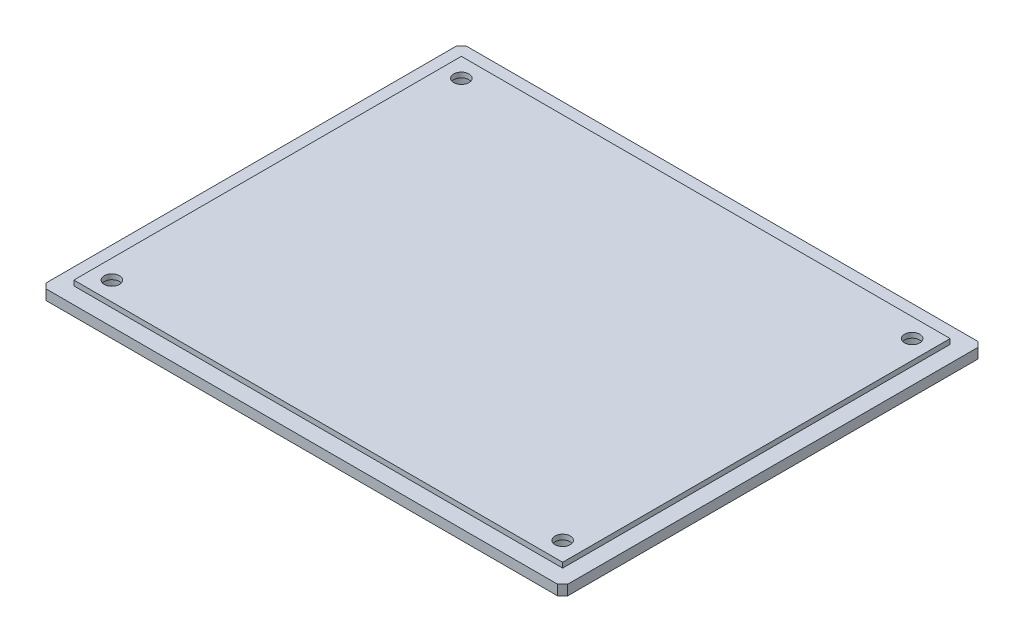
ISO-10303-21;
HEADER;
FILE_DESCRIPTION(('STEP AP214'),'2;1');
FILE_NAME('part.step','',(''),(''),'','','');
FILE_SCHEMA(('AUTOMOTIVE_DESIGN { 1 0 10303 214 1 1 1 1 }'));
ENDSEC;
DATA;
#1=APPLICATION_CONTEXT('core data for automotive mechanical design processes');
#2=APPLICATION_PROTOCOL_DEFINITION('international standard','automotive_design',2000,#1);
#3=PRODUCT_CONTEXT('',#1,'mechanical');
#4=PRODUCT('Part','Part','',(#3));
#5=PRODUCT_RELATED_PRODUCT_CATEGORY('part','',(#4));
#6=PRODUCT_DEFINITION_FORMATION('','',#4);
#7=PRODUCT_DEFINITION_CONTEXT('part definition',#1,'design');
#8=PRODUCT_DEFINITION('design','',#6,#7);
#9=PRODUCT_DEFINITION_SHAPE('','',#8);
#10=(LENGTH_UNIT() NAMED_UNIT(*) SI_UNIT(.MILLI.,.METRE.));
#11=(NAMED_UNIT(*) PLANE_ANGLE_UNIT() SI_UNIT($,.RADIAN.));
#12=(NAMED_UNIT(*) SI_UNIT($,.STERADIAN.) SOLID_ANGLE_UNIT());
#13=UNCERTAINTY_MEASURE_WITH_UNIT(LENGTH_MEASURE(1.E-05),#10,'distance_accuracy_value','');
#14=(GEOMETRIC_REPRESENTATION_CONTEXT(3) GLOBAL_UNCERTAINTY_ASSIGNED_CONTEXT((#13)) GLOBAL_UNIT_ASSIGNED_CONTEXT((#10,
#11,#12)) REPRESENTATION_CONTEXT('',''));
#15=CARTESIAN_POINT('',(0.,0.,0.));
#16=DIRECTION('',(0.,0.,1.));
#17=DIRECTION('',(1.,0.,0.));
#18=AXIS2_PLACEMENT_3D('',#15,#16,#17);
#19=CARTESIAN_POINT('',(-44.5,0.,-34.5));
#20=DIRECTION('',(0.,1.,0.));
#21=DIRECTION('',(0.,0.,1.));
#22=AXIS2_PLACEMENT_3D('',#19,#20,#21);
#23=CYLINDRICAL_SURFACE('',#22,1.5);
#24=CARTESIAN_POINT('',(-44.5,3.,-34.5));
#25=DIRECTION('',(0.,1.,0.));
#26=DIRECTION('',(0.,0.,1.));
#27=AXIS2_PLACEMENT_3D('',#24,#25,#26);
#28=CIRCLE('',#27,1.5);
#29=CARTESIAN_POINT('',(-44.5,3.,-33.));
#30=VERTEX_POINT('',#29);
#31=EDGE_CURVE('E278',#30,#30,#28,.T.);
#32=ORIENTED_EDGE('',*,*,#31,.T.);
#33=EDGE_LOOP('',(#32));
#34=FACE_BOUND('',#33,.T.);
#35=CARTESIAN_POINT('',(-44.5,2.,-34.5));
#36=DIRECTION('',(0.,-1.,0.));
#37=DIRECTION('',(0.,0.,-1.));
#38=AXIS2_PLACEMENT_3D('',#35,#36,#37);
#39=CIRCLE('',#38,1.5);
#40=CARTESIAN_POINT('',(-44.5,2.,-36.));
#41=VERTEX_POINT('',#40);
#42=EDGE_CURVE('E46',#41,#41,#39,.F.);
#43=ORIENTED_EDGE('',*,*,#42,.F.);
#44=EDGE_LOOP('',(#43));
#45=FACE_BOUND('',#44,.T.);
#46=ADVANCED_FACE('F41',(#34,#45),#23,.F.);
#47=CARTESIAN_POINT('',(44.5000000000007,0.,34.4999999999987));
#48=DIRECTION('',(0.,1.,0.));
#49=DIRECTION('',(0.,0.,1.));
#50=AXIS2_PLACEMENT_3D('',#47,#48,#49);
#51=CYLINDRICAL_SURFACE('',#50,1.5);
#52=CARTESIAN_POINT('',(44.5000000000007,3.,34.4999999999987));
#53=DIRECTION('',(0.,1.,0.));
#54=DIRECTION('',(0.,0.,1.));
#55=AXIS2_PLACEMENT_3D('',#52,#53,#54);
#56=CIRCLE('',#55,1.5);
#57=CARTESIAN_POINT('',(44.5000000000007,3.,35.9999999999987));
#58=VERTEX_POINT('',#57);
#59=EDGE_CURVE('E259',#58,#58,#56,.T.);
#60=ORIENTED_EDGE('',*,*,#59,.T.);
#61=EDGE_LOOP('',(#60));
#62=FACE_BOUND('',#61,.T.);
#63=CARTESIAN_POINT('',(44.5000000000007,2.,34.4999999999987));
#64=DIRECTION('',(0.,-1.,0.));
#65=DIRECTION('',(0.,0.,-1.));
#66=AXIS2_PLACEMENT_3D('',#63,#64,#65);
#67=CIRCLE('',#66,1.5);
#68=CARTESIAN_POINT('',(44.5000000000007,2.,32.9999999999987));
#69=VERTEX_POINT('',#68);
#70=EDGE_CURVE('E252',#69,#69,#67,.F.);
#71=ORIENTED_EDGE('',*,*,#70,.F.);
#72=EDGE_LOOP('',(#71));
#73=FACE_BOUND('',#72,.T.);
#74=ADVANCED_FACE('F358',(#62,#73),#51,.F.);
#75=CARTESIAN_POINT('',(-44.4999999999993,0.,34.5));
#76=DIRECTION('',(0.,1.,0.));
#77=DIRECTION('',(0.,0.,1.));
#78=AXIS2_PLACEMENT_3D('',#75,#76,#77);
#79=CYLINDRICAL_SURFACE('',#78,1.5);
#80=CARTESIAN_POINT('',(-44.4999999999993,3.,34.5));
#81=DIRECTION('',(0.,1.,0.));
#82=DIRECTION('',(0.,0.,1.));
#83=AXIS2_PLACEMENT_3D('',#80,#81,#82);
#84=CIRCLE('',#83,1.5);
#85=CARTESIAN_POINT('',(-44.4999999999993,3.,36.));
#86=VERTEX_POINT('',#85);
#87=EDGE_CURVE('E264',#86,#86,#84,.T.);
#88=ORIENTED_EDGE('',*,*,#87,.T.);
#89=EDGE_LOOP('',(#88));
#90=FACE_BOUND('',#89,.T.);
#91=CARTESIAN_POINT('',(-44.4999999999993,2.,34.5));
#92=DIRECTION('',(0.,-1.,0.));
#93=DIRECTION('',(0.,0.,-1.));
#94=AXIS2_PLACEMENT_3D('',#91,#92,#93);
#95=CIRCLE('',#94,1.5);
#96=CARTESIAN_POINT('',(-44.4999999999993,2.,33.));
#97=VERTEX_POINT('',#96);
#98=EDGE_CURVE('E248',#97,#97,#95,.F.);
#99=ORIENTED_EDGE('',*,*,#98,.F.);
#100=EDGE_LOOP('',(#99));
#101=FACE_BOUND('',#100,.T.);
#102=ADVANCED_FACE('F353',(#90,#101),#79,.F.);
#103=CARTESIAN_POINT('',(44.5,0.,-34.5000000000013));
#104=DIRECTION('',(0.,1.,0.));
#105=DIRECTION('',(0.,0.,1.));
#106=AXIS2_PLACEMENT_3D('',#103,#104,#105);
#107=CYLINDRICAL_SURFACE('',#106,1.5);
#108=CARTESIAN_POINT('',(44.5,3.,-34.5000000000013));
#109=DIRECTION('',(0.,1.,0.));
#110=DIRECTION('',(0.,0.,1.));
#111=AXIS2_PLACEMENT_3D('',#108,#109,#110);
#112=CIRCLE('',#111,1.5);
#113=CARTESIAN_POINT('',(44.5,3.,-33.0000000000013));
#114=VERTEX_POINT('',#113);
#115=EDGE_CURVE('E270',#114,#114,#112,.T.);
#116=ORIENTED_EDGE('',*,*,#115,.T.);
#117=EDGE_LOOP('',(#116));
#118=FACE_BOUND('',#117,.T.);
#119=CARTESIAN_POINT('',(44.5,2.,-34.5000000000013));
#120=DIRECTION('',(0.,-1.,0.));
#121=DIRECTION('',(0.,0.,-1.));
#122=AXIS2_PLACEMENT_3D('',#119,#120,#121);
#123=CIRCLE('',#122,1.5);
#124=CARTESIAN_POINT('',(44.5,2.,-36.0000000000013));
#125=VERTEX_POINT('',#124);
#126=EDGE_CURVE('E244',#125,#125,#123,.F.);
#127=ORIENTED_EDGE('',*,*,#126,.F.);
#128=EDGE_LOOP('',(#127));
#129=FACE_BOUND('',#128,.T.);
#130=ADVANCED_FACE('F346',(#118,#129),#107,.F.);
#131=CARTESIAN_POINT('',(51.5,2.,-41.5));
#132=DIRECTION('',(-1.,0.,0.));
#133=DIRECTION('',(0.,0.,1.));
#134=AXIS2_PLACEMENT_3D('',#131,#132,#133);
#135=PLANE('',#134);
#136=DIRECTION('',(0.,0.,-1.));
#137=VECTOR('',#136,1.);
#138=CARTESIAN_POINT('',(51.5,0.,-41.5));
#139=LINE('',#138,#137);
#140=CARTESIAN_POINT('',(51.5,0.,40.5));
#141=VERTEX_POINT('',#140);
#142=CARTESIAN_POINT('',(51.5,0.,-40.5));
#143=VERTEX_POINT('',#142);
#144=EDGE_CURVE('E163',#141,#143,#139,.T.);
#145=ORIENTED_EDGE('',*,*,#144,.T.);
#146=DIRECTION('',(0.,1.,0.));
#147=VECTOR('',#146,1.);
#148=CARTESIAN_POINT('',(51.5,2.,-40.5));
#149=LINE('',#148,#147);
#150=CARTESIAN_POINT('',(51.5,2.,-40.5));
#151=VERTEX_POINT('',#150);
#152=EDGE_CURVE('E221',#143,#151,#149,.T.);
#153=ORIENTED_EDGE('',*,*,#152,.T.);
#154=DIRECTION('',(0.,0.,-1.));
#155=VECTOR('',#154,1.);
#156=CARTESIAN_POINT('',(51.5,2.,-41.5));
#157=LINE('',#156,#155);
#158=CARTESIAN_POINT('',(51.5,2.,40.5));
#159=VERTEX_POINT('',#158);
#160=EDGE_CURVE('E174',#159,#151,#157,.T.);
#161=ORIENTED_EDGE('',*,*,#160,.F.);
#162=DIRECTION('',(0.,-1.,0.));
#163=VECTOR('',#162,1.);
#164=CARTESIAN_POINT('',(51.5,2.,40.5));
#165=LINE('',#164,#163);
#166=EDGE_CURVE('E217',#159,#141,#165,.T.);
#167=ORIENTED_EDGE('',*,*,#166,.T.);
#168=EDGE_LOOP('',(#145,#153,#161,#167));
#169=FACE_BOUND('',#168,.T.);
#170=ADVANCED_FACE('F344',(#169),#135,.F.);
#171=CARTESIAN_POINT('',(-51.5,2.,-41.5));
#172=DIRECTION('',(0.,0.,1.));
#173=DIRECTION('',(1.,0.,0.));
#174=AXIS2_PLACEMENT_3D('',#171,#172,#173);
#175=PLANE('',#174);
#176=DIRECTION('',(-1.,0.,0.));
#177=VECTOR('',#176,1.);
#178=CARTESIAN_POINT('',(-51.5,2.,-41.5));
#179=LINE('',#178,#177);
#180=CARTESIAN_POINT('',(50.5,2.,-41.5));
#181=VERTEX_POINT('',#180);
#182=CARTESIAN_POINT('',(-50.5,2.,-41.5));
#183=VERTEX_POINT('',#182);
#184=EDGE_CURVE('E178',#181,#183,#179,.T.);
#185=ORIENTED_EDGE('',*,*,#184,.F.);
#186=DIRECTION('',(0.,-1.,0.));
#187=VECTOR('',#186,1.);
#188=CARTESIAN_POINT('',(50.5,2.,-41.5));
#189=LINE('',#188,#187);
#190=CARTESIAN_POINT('',(50.5,0.,-41.5));
#191=VERTEX_POINT('',#190);
#192=EDGE_CURVE('E201',#181,#191,#189,.T.);
#193=ORIENTED_EDGE('',*,*,#192,.T.);
#194=DIRECTION('',(-1.,0.,0.));
#195=VECTOR('',#194,1.);
#196=CARTESIAN_POINT('',(-51.5,0.,-41.5));
#197=LINE('',#196,#195);
#198=CARTESIAN_POINT('',(-50.5,0.,-41.5));
#199=VERTEX_POINT('',#198);
#200=EDGE_CURVE('E168',#191,#199,#197,.T.);
#201=ORIENTED_EDGE('',*,*,#200,.T.);
#202=DIRECTION('',(0.,1.,0.));
#203=VECTOR('',#202,1.);
#204=CARTESIAN_POINT('',(-50.5,2.,-41.5));
#205=LINE('',#204,#203);
#206=EDGE_CURVE('E188',#199,#183,#205,.T.);
#207=ORIENTED_EDGE('',*,*,#206,.T.);
#208=EDGE_LOOP('',(#185,#193,#201,#207));
#209=FACE_BOUND('',#208,.T.);
#210=ADVANCED_FACE('F326',(#209),#175,.F.);
#211=CARTESIAN_POINT('',(-51.5,2.,-41.5));
#212=DIRECTION('',(1.,0.,0.));
#213=DIRECTION('',(0.,0.,-1.));
#214=AXIS2_PLACEMENT_3D('',#211,#212,#213);
#215=PLANE('',#214);
#216=DIRECTION('',(0.,0.,1.));
#217=VECTOR('',#216,1.);
#218=CARTESIAN_POINT('',(-51.5,0.,-41.5));
#219=LINE('',#218,#217);
#220=CARTESIAN_POINT('',(-51.5,0.,-40.5));
#221=VERTEX_POINT('',#220);
#222=CARTESIAN_POINT('',(-51.5,0.,40.5));
#223=VERTEX_POINT('',#222);
#224=EDGE_CURVE('E193',#221,#223,#219,.T.);
#225=ORIENTED_EDGE('',*,*,#224,.T.);
#226=DIRECTION('',(0.,1.,0.));
#227=VECTOR('',#226,1.);
#228=CARTESIAN_POINT('',(-51.5,2.,40.5));
#229=LINE('',#228,#227);
#230=CARTESIAN_POINT('',(-51.5,2.,40.5));
#231=VERTEX_POINT('',#230);
#232=EDGE_CURVE('E11',#223,#231,#229,.T.);
#233=ORIENTED_EDGE('',*,*,#232,.T.);
#234=DIRECTION('',(0.,0.,1.));
#235=VECTOR('',#234,1.);
#236=CARTESIAN_POINT('',(-51.5,2.,-41.5));
#237=LINE('',#236,#235);
#238=CARTESIAN_POINT('',(-51.5,2.,-40.5));
#239=VERTEX_POINT('',#238);
#240=EDGE_CURVE('E183',#239,#231,#237,.T.);
#241=ORIENTED_EDGE('',*,*,#240,.F.);
#242=DIRECTION('',(0.,-1.,0.));
#243=VECTOR('',#242,1.);
#244=CARTESIAN_POINT('',(-51.5,2.,-40.5));
#245=LINE('',#244,#243);
#246=EDGE_CURVE('E52',#239,#221,#245,.T.);
#247=ORIENTED_EDGE('',*,*,#246,.T.);
#248=EDGE_LOOP('',(#225,#233,#241,#247));
#249=FACE_BOUND('',#248,.T.);
#250=ADVANCED_FACE('F336',(#249),#215,.F.);
#251=CARTESIAN_POINT('',(-51.5,2.,41.5));
#252=DIRECTION('',(0.,0.,-1.));
#253=DIRECTION('',(-1.,0.,0.));
#254=AXIS2_PLACEMENT_3D('',#251,#252,#253);
#255=PLANE('',#254);
#256=DIRECTION('',(1.,0.,0.));
#257=VECTOR('',#256,1.);
#258=CARTESIAN_POINT('',(-51.5,0.,41.5));
#259=LINE('',#258,#257);
#260=CARTESIAN_POINT('',(-50.5,0.,41.5));
#261=VERTEX_POINT('',#260);
#262=CARTESIAN_POINT('',(50.5,0.,41.5));
#263=VERTEX_POINT('',#262);
#264=EDGE_CURVE('E179',#261,#263,#259,.T.);
#265=ORIENTED_EDGE('',*,*,#264,.T.);
#266=DIRECTION('',(0.,1.,0.));
#267=VECTOR('',#266,1.);
#268=CARTESIAN_POINT('',(50.5,2.,41.5));
#269=LINE('',#268,#267);
#270=CARTESIAN_POINT('',(50.5,2.,41.5));
#271=VERTEX_POINT('',#270);
#272=EDGE_CURVE('E60',#263,#271,#269,.T.);
#273=ORIENTED_EDGE('',*,*,#272,.T.);
#274=DIRECTION('',(1.,0.,0.));
#275=VECTOR('',#274,1.);
#276=CARTESIAN_POINT('',(-51.5,2.,41.5));
#277=LINE('',#276,#275);
#278=CARTESIAN_POINT('',(-50.5,2.,41.5));
#279=VERTEX_POINT('',#278);
#280=EDGE_CURVE('E186',#279,#271,#277,.T.);
#281=ORIENTED_EDGE('',*,*,#280,.F.);
#282=DIRECTION('',(0.,-1.,0.));
#283=VECTOR('',#282,1.);
#284=CARTESIAN_POINT('',(-50.5,2.,41.5));
#285=LINE('',#284,#283);
#286=EDGE_CURVE('E235',#279,#261,#285,.T.);
#287=ORIENTED_EDGE('',*,*,#286,.T.);
#288=EDGE_LOOP('',(#265,#273,#281,#287));
#289=FACE_BOUND('',#288,.T.);
#290=ADVANCED_FACE('F312',(#289),#255,.F.);
#291=CARTESIAN_POINT('',(0.,2.,0.));
#292=DIRECTION('',(0.,1.,0.));
#293=DIRECTION('',(0.,0.,1.));
#294=AXIS2_PLACEMENT_3D('',#291,#292,#293);
#295=PLANE('',#294);
#296=DIRECTION('',(0.,0.,-1.));
#297=VECTOR('',#296,1.);
#298=CARTESIAN_POINT('',(48.25,2.,-38.25));
#299=LINE('',#298,#297);
#300=CARTESIAN_POINT('',(48.25,2.,38.25));
#301=VERTEX_POINT('',#300);
#302=CARTESIAN_POINT('',(48.25,2.,-38.25));
#303=VERTEX_POINT('',#302);
#304=EDGE_CURVE('E161',#301,#303,#299,.T.);
#305=ORIENTED_EDGE('',*,*,#304,.F.);
#306=DIRECTION('',(1.,0.,0.));
#307=VECTOR('',#306,1.);
#308=CARTESIAN_POINT('',(-48.25,2.,38.25));
#309=LINE('',#308,#307);
#310=CARTESIAN_POINT('',(-48.25,2.,38.25));
#311=VERTEX_POINT('',#310);
#312=EDGE_CURVE('E158',#311,#301,#309,.T.);
#313=ORIENTED_EDGE('',*,*,#312,.F.);
#314=DIRECTION('',(0.,0.,1.));
#315=VECTOR('',#314,1.);
#316=CARTESIAN_POINT('',(-48.25,2.,-38.25));
#317=LINE('',#316,#315);
#318=CARTESIAN_POINT('',(-48.25,2.,-38.25));
#319=VERTEX_POINT('',#318);
#320=EDGE_CURVE('E293',#319,#311,#317,.T.);
#321=ORIENTED_EDGE('',*,*,#320,.F.);
#322=DIRECTION('',(-1.,0.,0.));
#323=VECTOR('',#322,1.);
#324=CARTESIAN_POINT('',(-48.25,2.,-38.25));
#325=LINE('',#324,#323);
#326=EDGE_CURVE('E290',#303,#319,#325,.T.);
#327=ORIENTED_EDGE('',*,*,#326,.F.);
#328=EDGE_LOOP('',(#305,#313,#321,#327));
#329=FACE_BOUND('',#328,.T.);
#330=ORIENTED_EDGE('',*,*,#160,.T.);
#331=DIRECTION('',(0.707106781186548,0.,0.707106781186548));
#332=VECTOR('',#331,1.);
#333=CARTESIAN_POINT('',(46.,2.,-46.));
#334=LINE('',#333,#332);
#335=EDGE_CURVE('E232',#151,#181,#334,.F.);
#336=ORIENTED_EDGE('',*,*,#335,.T.);
#337=ORIENTED_EDGE('',*,*,#184,.T.);
#338=DIRECTION('',(0.707106781186552,0.,-0.707106781186543));
#339=VECTOR('',#338,1.);
#340=CARTESIAN_POINT('',(-45.9999999999996,2.,-46.0000000000003));
#341=LINE('',#340,#339);
#342=EDGE_CURVE('E224',#183,#239,#341,.F.);
#343=ORIENTED_EDGE('',*,*,#342,.T.);
#344=ORIENTED_EDGE('',*,*,#240,.T.);
#345=DIRECTION('',(-0.707106781186548,0.,-0.707106781186548));
#346=VECTOR('',#345,1.);
#347=CARTESIAN_POINT('',(-46.,2.,46.));
#348=LINE('',#347,#346);
#349=EDGE_CURVE('E67',#231,#279,#348,.F.);
#350=ORIENTED_EDGE('',*,*,#349,.T.);
#351=ORIENTED_EDGE('',*,*,#280,.T.);
#352=DIRECTION('',(-0.707106781186555,0.,0.70710678118654));
#353=VECTOR('',#352,1.);
#354=CARTESIAN_POINT('',(45.9999999999995,2.,46.0000000000004));
#355=LINE('',#354,#353);
#356=EDGE_CURVE('E229',#271,#159,#355,.F.);
#357=ORIENTED_EDGE('',*,*,#356,.T.);
#358=EDGE_LOOP('',(#330,#336,#337,#343,#344,#350,#351,#357));
#359=FACE_BOUND('',#358,.T.);
#360=ADVANCED_FACE('F309',(#329,#359),#295,.T.);
#361=CARTESIAN_POINT('',(0.,0.,0.));
#362=DIRECTION('',(0.,1.,0.));
#363=DIRECTION('',(0.,0.,1.));
#364=AXIS2_PLACEMENT_3D('',#361,#362,#363);
#365=PLANE('',#364);
#366=CARTESIAN_POINT('',(-44.4999999999986,0.,-34.5));
#367=DIRECTION('',(0.,-1.,0.));
#368=DIRECTION('',(0.,0.,-1.));
#369=AXIS2_PLACEMENT_3D('',#366,#367,#368);
#370=CIRCLE('',#369,2.8);
#371=CARTESIAN_POINT('',(-44.4999999999986,0.,-37.3));
#372=VERTEX_POINT('',#371);
#373=EDGE_CURVE('E596',#372,#372,#370,.T.);
#374=ORIENTED_EDGE('',*,*,#373,.F.);
#375=EDGE_LOOP('',(#374));
#376=FACE_BOUND('',#375,.T.);
#377=CARTESIAN_POINT('',(44.5000000000014,0.,-34.5));
#378=DIRECTION('',(0.,-1.,0.));
#379=DIRECTION('',(0.,0.,-1.));
#380=AXIS2_PLACEMENT_3D('',#377,#378,#379);
#381=CIRCLE('',#380,2.8);
#382=CARTESIAN_POINT('',(44.5000000000014,0.,-37.3));
#383=VERTEX_POINT('',#382);
#384=EDGE_CURVE('E600',#383,#383,#381,.T.);
#385=ORIENTED_EDGE('',*,*,#384,.F.);
#386=EDGE_LOOP('',(#385));
#387=FACE_BOUND('',#386,.T.);
#388=CARTESIAN_POINT('',(44.5000000000007,0.,34.5));
#389=DIRECTION('',(0.,-1.,0.));
#390=DIRECTION('',(0.,0.,-1.));
#391=AXIS2_PLACEMENT_3D('',#388,#389,#390);
#392=CIRCLE('',#391,2.8);
#393=CARTESIAN_POINT('',(44.5000000000007,0.,31.7));
#394=VERTEX_POINT('',#393);
#395=EDGE_CURVE('E613',#394,#394,#392,.T.);
#396=ORIENTED_EDGE('',*,*,#395,.F.);
#397=EDGE_LOOP('',(#396));
#398=FACE_BOUND('',#397,.T.);
#399=CARTESIAN_POINT('',(-44.4999999999993,0.,34.5));
#400=DIRECTION('',(0.,-1.,0.));
#401=DIRECTION('',(0.,0.,-1.));
#402=AXIS2_PLACEMENT_3D('',#399,#400,#401);
#403=CIRCLE('',#402,2.8);
#404=CARTESIAN_POINT('',(-44.4999999999993,0.,31.7));
#405=VERTEX_POINT('',#404);
#406=EDGE_CURVE('E274',#405,#405,#403,.T.);
#407=ORIENTED_EDGE('',*,*,#406,.F.);
#408=EDGE_LOOP('',(#407));
#409=FACE_BOUND('',#408,.T.);
#410=ORIENTED_EDGE('',*,*,#200,.F.);
#411=DIRECTION('',(-0.707106781186548,0.,-0.707106781186548));
#412=VECTOR('',#411,1.);
#413=CARTESIAN_POINT('',(50.5,0.,-41.5));
#414=LINE('',#413,#412);
#415=EDGE_CURVE('E214',#191,#143,#414,.F.);
#416=ORIENTED_EDGE('',*,*,#415,.T.);
#417=ORIENTED_EDGE('',*,*,#144,.F.);
#418=DIRECTION('',(0.707106781186555,0.,-0.70710678118654));
#419=VECTOR('',#418,1.);
#420=CARTESIAN_POINT('',(51.5,0.,40.5));
#421=LINE('',#420,#419);
#422=EDGE_CURVE('E211',#141,#263,#421,.F.);
#423=ORIENTED_EDGE('',*,*,#422,.T.);
#424=ORIENTED_EDGE('',*,*,#264,.F.);
#425=DIRECTION('',(0.707106781186548,0.,0.707106781186548));
#426=VECTOR('',#425,1.);
#427=CARTESIAN_POINT('',(-50.5,0.,41.5));
#428=LINE('',#427,#426);
#429=EDGE_CURVE('E208',#261,#223,#428,.F.);
#430=ORIENTED_EDGE('',*,*,#429,.T.);
#431=ORIENTED_EDGE('',*,*,#224,.F.);
#432=DIRECTION('',(-0.707106781186552,0.,0.707106781186543));
#433=VECTOR('',#432,1.);
#434=CARTESIAN_POINT('',(-51.5,0.,-40.5));
#435=LINE('',#434,#433);
#436=EDGE_CURVE('E205',#221,#199,#435,.F.);
#437=ORIENTED_EDGE('',*,*,#436,.T.);
#438=EDGE_LOOP('',(#410,#416,#417,#423,#424,#430,#431,#437));
#439=FACE_BOUND('',#438,.T.);
#440=ADVANCED_FACE('F311',(#376,#387,#398,#409,#439),#365,.F.);
#441=CARTESIAN_POINT('',(48.25,3.,-38.25));
#442=DIRECTION('',(-1.,0.,0.));
#443=DIRECTION('',(0.,0.,1.));
#444=AXIS2_PLACEMENT_3D('',#441,#442,#443);
#445=PLANE('',#444);
#446=ORIENTED_EDGE('',*,*,#304,.T.);
#447=DIRECTION('',(0.,-1.,0.));
#448=VECTOR('',#447,1.);
#449=CARTESIAN_POINT('',(48.25,3.,-38.25));
#450=LINE('',#449,#448);
#451=CARTESIAN_POINT('',(48.25,3.,-38.25));
#452=VERTEX_POINT('',#451);
#453=EDGE_CURVE('E140',#452,#303,#450,.T.);
#454=ORIENTED_EDGE('',*,*,#453,.F.);
#455=DIRECTION('',(0.,0.,-1.));
#456=VECTOR('',#455,1.);
#457=CARTESIAN_POINT('',(48.25,3.,-38.25));
#458=LINE('',#457,#456);
#459=CARTESIAN_POINT('',(48.25,3.,38.25));
#460=VERTEX_POINT('',#459);
#461=EDGE_CURVE('E148',#460,#452,#458,.T.);
#462=ORIENTED_EDGE('',*,*,#461,.F.);
#463=DIRECTION('',(0.,-1.,0.));
#464=VECTOR('',#463,1.);
#465=CARTESIAN_POINT('',(48.25,3.,38.25));
#466=LINE('',#465,#464);
#467=EDGE_CURVE('E287',#460,#301,#466,.T.);
#468=ORIENTED_EDGE('',*,*,#467,.T.);
#469=EDGE_LOOP('',(#446,#454,#462,#468));
#470=FACE_BOUND('',#469,.T.);
#471=ADVANCED_FACE('F160',(#470),#445,.F.);
#472=CARTESIAN_POINT('',(-48.25,3.,-38.25));
#473=DIRECTION('',(0.,0.,1.));
#474=DIRECTION('',(1.,0.,0.));
#475=AXIS2_PLACEMENT_3D('',#472,#473,#474);
#476=PLANE('',#475);
#477=ORIENTED_EDGE('',*,*,#326,.T.);
#478=DIRECTION('',(0.,-1.,0.));
#479=VECTOR('',#478,1.);
#480=CARTESIAN_POINT('',(-48.25,3.,-38.25));
#481=LINE('',#480,#479);
#482=CARTESIAN_POINT('',(-48.25,3.,-38.25));
#483=VERTEX_POINT('',#482);
#484=EDGE_CURVE('E143',#483,#319,#481,.T.);
#485=ORIENTED_EDGE('',*,*,#484,.F.);
#486=DIRECTION('',(-1.,0.,0.));
#487=VECTOR('',#486,1.);
#488=CARTESIAN_POINT('',(-48.25,3.,-38.25));
#489=LINE('',#488,#487);
#490=EDGE_CURVE('E135',#452,#483,#489,.T.);
#491=ORIENTED_EDGE('',*,*,#490,.F.);
#492=ORIENTED_EDGE('',*,*,#453,.T.);
#493=EDGE_LOOP('',(#477,#485,#491,#492));
#494=FACE_BOUND('',#493,.T.);
#495=ADVANCED_FACE('F138',(#494),#476,.F.);
#496=CARTESIAN_POINT('',(-48.25,3.,-38.25));
#497=DIRECTION('',(1.,0.,0.));
#498=DIRECTION('',(0.,0.,-1.));
#499=AXIS2_PLACEMENT_3D('',#496,#497,#498);
#500=PLANE('',#499);
#501=ORIENTED_EDGE('',*,*,#320,.T.);
#502=DIRECTION('',(0.,-1.,0.));
#503=VECTOR('',#502,1.);
#504=CARTESIAN_POINT('',(-48.25,3.,38.25));
#505=LINE('',#504,#503);
#506=CARTESIAN_POINT('',(-48.25,3.,38.25));
#507=VERTEX_POINT('',#506);
#508=EDGE_CURVE('E170',#507,#311,#505,.T.);
#509=ORIENTED_EDGE('',*,*,#508,.F.);
#510=DIRECTION('',(0.,0.,1.));
#511=VECTOR('',#510,1.);
#512=CARTESIAN_POINT('',(-48.25,3.,-38.25));
#513=LINE('',#512,#511);
#514=EDGE_CURVE('E147',#483,#507,#513,.T.);
#515=ORIENTED_EDGE('',*,*,#514,.F.);
#516=ORIENTED_EDGE('',*,*,#484,.T.);
#517=EDGE_LOOP('',(#501,#509,#515,#516));
#518=FACE_BOUND('',#517,.T.);
#519=ADVANCED_FACE('F307',(#518),#500,.F.);
#520=CARTESIAN_POINT('',(-48.25,3.,38.25));
#521=DIRECTION('',(0.,0.,-1.));
#522=DIRECTION('',(-1.,0.,0.));
#523=AXIS2_PLACEMENT_3D('',#520,#521,#522);
#524=PLANE('',#523);
#525=ORIENTED_EDGE('',*,*,#312,.T.);
#526=ORIENTED_EDGE('',*,*,#467,.F.);
#527=DIRECTION('',(1.,0.,0.));
#528=VECTOR('',#527,1.);
#529=CARTESIAN_POINT('',(-48.25,3.,38.25));
#530=LINE('',#529,#528);
#531=EDGE_CURVE('E153',#507,#460,#530,.T.);
#532=ORIENTED_EDGE('',*,*,#531,.F.);
#533=ORIENTED_EDGE('',*,*,#508,.T.);
#534=EDGE_LOOP('',(#525,#526,#532,#533));
#535=FACE_BOUND('',#534,.T.);
#536=ADVANCED_FACE('F305',(#535),#524,.F.);
#537=CARTESIAN_POINT('',(0.,3.,0.));
#538=DIRECTION('',(0.,1.,0.));
#539=DIRECTION('',(0.,0.,1.));
#540=AXIS2_PLACEMENT_3D('',#537,#538,#539);
#541=PLANE('',#540);
#542=ORIENTED_EDGE('',*,*,#115,.F.);
#543=EDGE_LOOP('',(#542));
#544=FACE_BOUND('',#543,.T.);
#545=ORIENTED_EDGE('',*,*,#87,.F.);
#546=EDGE_LOOP('',(#545));
#547=FACE_BOUND('',#546,.T.);
#548=ORIENTED_EDGE('',*,*,#59,.F.);
#549=EDGE_LOOP('',(#548));
#550=FACE_BOUND('',#549,.T.);
#551=ORIENTED_EDGE('',*,*,#31,.F.);
#552=EDGE_LOOP('',(#551));
#553=FACE_BOUND('',#552,.T.);
#554=ORIENTED_EDGE('',*,*,#461,.T.);
#555=ORIENTED_EDGE('',*,*,#490,.T.);
#556=ORIENTED_EDGE('',*,*,#514,.T.);
#557=ORIENTED_EDGE('',*,*,#531,.T.);
#558=EDGE_LOOP('',(#554,#555,#556,#557));
#559=FACE_BOUND('',#558,.T.);
#560=ADVANCED_FACE('F151',(#544,#547,#550,#553,#559),#541,.T.);
#561=CARTESIAN_POINT('',(50.5,2.,-41.5));
#562=DIRECTION('',(-0.707106781186547,0.,0.707106781186547));
#563=DIRECTION('',(0.,-1.,0.));
#564=AXIS2_PLACEMENT_3D('',#561,#562,#563);
#565=PLANE('',#564);
#566=ORIENTED_EDGE('',*,*,#335,.F.);
#567=ORIENTED_EDGE('',*,*,#152,.F.);
#568=ORIENTED_EDGE('',*,*,#415,.F.);
#569=ORIENTED_EDGE('',*,*,#192,.F.);
#570=EDGE_LOOP('',(#566,#567,#568,#569));
#571=FACE_BOUND('',#570,.T.);
#572=ADVANCED_FACE('F323',(#571),#565,.F.);
#573=CARTESIAN_POINT('',(51.5,2.,40.5));
#574=DIRECTION('',(-0.70710678118654,0.,-0.707106781186555));
#575=DIRECTION('',(0.,-1.,0.));
#576=AXIS2_PLACEMENT_3D('',#573,#574,#575);
#577=PLANE('',#576);
#578=ORIENTED_EDGE('',*,*,#356,.F.);
#579=ORIENTED_EDGE('',*,*,#272,.F.);
#580=ORIENTED_EDGE('',*,*,#422,.F.);
#581=ORIENTED_EDGE('',*,*,#166,.F.);
#582=EDGE_LOOP('',(#578,#579,#580,#581));
#583=FACE_BOUND('',#582,.T.);
#584=ADVANCED_FACE('F343',(#583),#577,.F.);
#585=CARTESIAN_POINT('',(-50.5,2.,41.5));
#586=DIRECTION('',(0.707106781186547,0.,-0.707106781186547));
#587=DIRECTION('',(0.,-1.,0.));
#588=AXIS2_PLACEMENT_3D('',#585,#586,#587);
#589=PLANE('',#588);
#590=ORIENTED_EDGE('',*,*,#349,.F.);
#591=ORIENTED_EDGE('',*,*,#232,.F.);
#592=ORIENTED_EDGE('',*,*,#429,.F.);
#593=ORIENTED_EDGE('',*,*,#286,.F.);
#594=EDGE_LOOP('',(#590,#591,#592,#593));
#595=FACE_BOUND('',#594,.T.);
#596=ADVANCED_FACE('F340',(#595),#589,.F.);
#597=CARTESIAN_POINT('',(-51.5,2.,-40.5));
#598=DIRECTION('',(0.707106781186543,0.,0.707106781186552));
#599=DIRECTION('',(0.,-1.,0.));
#600=AXIS2_PLACEMENT_3D('',#597,#598,#599);
#601=PLANE('',#600);
#602=ORIENTED_EDGE('',*,*,#342,.F.);
#603=ORIENTED_EDGE('',*,*,#206,.F.);
#604=ORIENTED_EDGE('',*,*,#436,.F.);
#605=ORIENTED_EDGE('',*,*,#246,.F.);
#606=EDGE_LOOP('',(#602,#603,#604,#605));
#607=FACE_BOUND('',#606,.T.);
#608=ADVANCED_FACE('F44',(#607),#601,.F.);
#609=CARTESIAN_POINT('',(44.5000000000014,2.,-34.5));
#610=DIRECTION('',(0.,-1.,0.));
#611=DIRECTION('',(0.,0.,-1.));
#612=AXIS2_PLACEMENT_3D('',#609,#610,#611);
#613=PLANE('',#612);
#614=CARTESIAN_POINT('',(44.5000000000014,2.,-34.5));
#615=DIRECTION('',(0.,-1.,0.));
#616=DIRECTION('',(0.,0.,-1.));
#617=AXIS2_PLACEMENT_3D('',#614,#615,#616);
#618=CIRCLE('',#617,2.8);
#619=CARTESIAN_POINT('',(44.5000000000014,2.,-37.3));
#620=VERTEX_POINT('',#619);
#621=EDGE_CURVE('E618',#620,#620,#618,.T.);
#622=ORIENTED_EDGE('',*,*,#621,.T.);
#623=EDGE_LOOP('',(#622));
#624=FACE_BOUND('',#623,.T.);
#625=ORIENTED_EDGE('',*,*,#126,.T.);
#626=EDGE_LOOP('',(#625));
#627=FACE_BOUND('',#626,.T.);
#628=ADVANCED_FACE('F445',(#624,#627),#613,.T.);
#629=CARTESIAN_POINT('',(44.5000000000014,2.,-34.5));
#630=DIRECTION('',(0.,-1.,0.));
#631=DIRECTION('',(0.,0.,-1.));
#632=AXIS2_PLACEMENT_3D('',#629,#630,#631);
#633=CYLINDRICAL_SURFACE('',#632,2.8);
#634=ORIENTED_EDGE('',*,*,#621,.F.);
#635=EDGE_LOOP('',(#634));
#636=FACE_BOUND('',#635,.T.);
#637=ORIENTED_EDGE('',*,*,#384,.T.);
#638=EDGE_LOOP('',(#637));
#639=FACE_BOUND('',#638,.T.);
#640=ADVANCED_FACE('F450',(#636,#639),#633,.F.);
#641=CARTESIAN_POINT('',(-44.4999999999993,2.,34.5));
#642=DIRECTION('',(0.,-1.,0.));
#643=DIRECTION('',(0.,0.,-1.));
#644=AXIS2_PLACEMENT_3D('',#641,#642,#643);
#645=PLANE('',#644);
#646=CARTESIAN_POINT('',(-44.4999999999993,2.,34.5));
#647=DIRECTION('',(0.,-1.,0.));
#648=DIRECTION('',(0.,0.,-1.));
#649=AXIS2_PLACEMENT_3D('',#646,#647,#648);
#650=CIRCLE('',#649,2.8);
#651=CARTESIAN_POINT('',(-44.4999999999993,2.,31.7));
#652=VERTEX_POINT('',#651);
#653=EDGE_CURVE('E249',#652,#652,#650,.T.);
#654=ORIENTED_EDGE('',*,*,#653,.T.);
#655=EDGE_LOOP('',(#654));
#656=FACE_BOUND('',#655,.T.);
#657=ORIENTED_EDGE('',*,*,#98,.T.);
#658=EDGE_LOOP('',(#657));
#659=FACE_BOUND('',#658,.T.);
#660=ADVANCED_FACE('F458',(#656,#659),#645,.T.);
#661=CARTESIAN_POINT('',(-44.4999999999993,2.,34.5));
#662=DIRECTION('',(0.,-1.,0.));
#663=DIRECTION('',(0.,0.,-1.));
#664=AXIS2_PLACEMENT_3D('',#661,#662,#663);
#665=CYLINDRICAL_SURFACE('',#664,2.8);
#666=ORIENTED_EDGE('',*,*,#653,.F.);
#667=EDGE_LOOP('',(#666));
#668=FACE_BOUND('',#667,.T.);
#669=ORIENTED_EDGE('',*,*,#406,.T.);
#670=EDGE_LOOP('',(#669));
#671=FACE_BOUND('',#670,.T.);
#672=ADVANCED_FACE('F466',(#668,#671),#665,.F.);
#673=CARTESIAN_POINT('',(44.5000000000007,2.,34.5));
#674=DIRECTION('',(0.,-1.,0.));
#675=DIRECTION('',(0.,0.,-1.));
#676=AXIS2_PLACEMENT_3D('',#673,#674,#675);
#677=PLANE('',#676);
#678=CARTESIAN_POINT('',(44.5000000000007,2.,34.5));
#679=DIRECTION('',(0.,-1.,0.));
#680=DIRECTION('',(0.,0.,-1.));
#681=AXIS2_PLACEMENT_3D('',#678,#679,#680);
#682=CIRCLE('',#681,2.8);
#683=CARTESIAN_POINT('',(44.5000000000007,2.,31.7));
#684=VERTEX_POINT('',#683);
#685=EDGE_CURVE('E608',#684,#684,#682,.T.);
#686=ORIENTED_EDGE('',*,*,#685,.T.);
#687=EDGE_LOOP('',(#686));
#688=FACE_BOUND('',#687,.T.);
#689=ORIENTED_EDGE('',*,*,#70,.T.);
#690=EDGE_LOOP('',(#689));
#691=FACE_BOUND('',#690,.T.);
#692=ADVANCED_FACE('F474',(#688,#691),#677,.T.);
#693=CARTESIAN_POINT('',(44.5000000000007,2.,34.5));
#694=DIRECTION('',(0.,-1.,0.));
#695=DIRECTION('',(0.,0.,-1.));
#696=AXIS2_PLACEMENT_3D('',#693,#694,#695);
#697=CYLINDRICAL_SURFACE('',#696,2.8);
#698=ORIENTED_EDGE('',*,*,#685,.F.);
#699=EDGE_LOOP('',(#698));
#700=FACE_BOUND('',#699,.T.);
#701=ORIENTED_EDGE('',*,*,#395,.T.);
#702=EDGE_LOOP('',(#701));
#703=FACE_BOUND('',#702,.T.);
#704=ADVANCED_FACE('F482',(#700,#703),#697,.F.);
#705=CARTESIAN_POINT('',(-44.4999999999986,2.,-34.5));
#706=DIRECTION('',(0.,-1.,0.));
#707=DIRECTION('',(0.,0.,-1.));
#708=AXIS2_PLACEMENT_3D('',#705,#706,#707);
#709=PLANE('',#708);
#710=CARTESIAN_POINT('',(-44.4999999999986,2.,-34.5));
#711=DIRECTION('',(0.,-1.,0.));
#712=DIRECTION('',(0.,0.,-1.));
#713=AXIS2_PLACEMENT_3D('',#710,#711,#712);
#714=CIRCLE('',#713,2.8);
#715=CARTESIAN_POINT('',(-44.4999999999986,2.,-37.3));
#716=VERTEX_POINT('',#715);
#717=EDGE_CURVE('E593',#716,#716,#714,.T.);
#718=ORIENTED_EDGE('',*,*,#717,.T.);
#719=EDGE_LOOP('',(#718));
#720=FACE_BOUND('',#719,.T.);
#721=ORIENTED_EDGE('',*,*,#42,.T.);
#722=EDGE_LOOP('',(#721));
#723=FACE_BOUND('',#722,.T.);
#724=ADVANCED_FACE('F490',(#720,#723),#709,.T.);
#725=CARTESIAN_POINT('',(-44.4999999999986,2.,-34.5));
#726=DIRECTION('',(0.,-1.,0.));
#727=DIRECTION('',(0.,0.,-1.));
#728=AXIS2_PLACEMENT_3D('',#725,#726,#727);
#729=CYLINDRICAL_SURFACE('',#728,2.8);
#730=ORIENTED_EDGE('',*,*,#717,.F.);
#731=EDGE_LOOP('',(#730));
#732=FACE_BOUND('',#731,.T.);
#733=ORIENTED_EDGE('',*,*,#373,.T.);
#734=EDGE_LOOP('',(#733));
#735=FACE_BOUND('',#734,.T.);
#736=ADVANCED_FACE('F498',(#732,#735),#729,.F.);
#737=CLOSED_SHELL('',(#46,#74,#102,#130,#170,#210,#250,#290,#360,#440,#471,#495,#519,#536,#560,
#572,#584,#596,#608,#628,#640,#660,#672,#692,#704,#724,#736));
#738=MANIFOLD_SOLID_BREP('B2',#737);
#739=ADVANCED_BREP_SHAPE_REPRESENTATION('',(#18,#738),#14);
#740=SHAPE_DEFINITION_REPRESENTATION(#9,#739);
ENDSEC;
END-ISO-10303-21;
